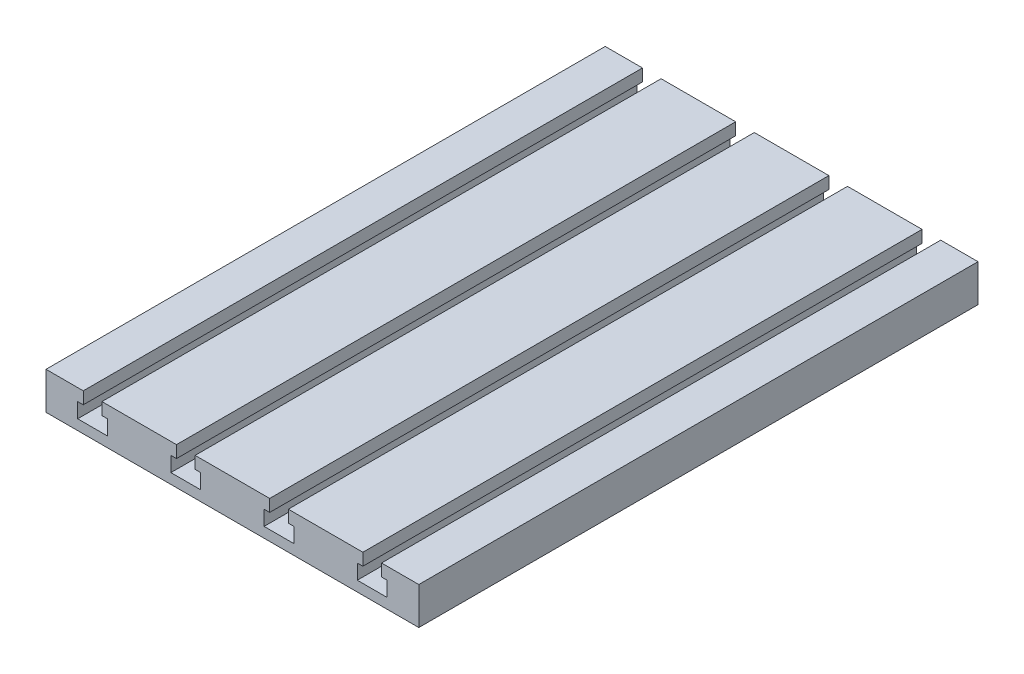
ISO-10303-21;
HEADER;
FILE_DESCRIPTION(('STEP AP214'),'2;1');
FILE_NAME('part.step','',(''),(''),'','','');
FILE_SCHEMA(('AUTOMOTIVE_DESIGN { 1 0 10303 214 1 1 1 1 }'));
ENDSEC;
DATA;
#1=APPLICATION_CONTEXT('core data for automotive mechanical design processes');
#2=APPLICATION_PROTOCOL_DEFINITION('international standard','automotive_design',2000,#1);
#3=PRODUCT_CONTEXT('',#1,'mechanical');
#4=PRODUCT('Part','Part','',(#3));
#5=PRODUCT_RELATED_PRODUCT_CATEGORY('part','',(#4));
#6=PRODUCT_DEFINITION_FORMATION('','',#4);
#7=PRODUCT_DEFINITION_CONTEXT('part definition',#1,'design');
#8=PRODUCT_DEFINITION('design','',#6,#7);
#9=PRODUCT_DEFINITION_SHAPE('','',#8);
#10=(LENGTH_UNIT() NAMED_UNIT(*) SI_UNIT(.MILLI.,.METRE.));
#11=(NAMED_UNIT(*) PLANE_ANGLE_UNIT() SI_UNIT($,.RADIAN.));
#12=(NAMED_UNIT(*) SI_UNIT($,.STERADIAN.) SOLID_ANGLE_UNIT());
#13=UNCERTAINTY_MEASURE_WITH_UNIT(LENGTH_MEASURE(1.E-05),#10,'distance_accuracy_value','');
#14=(GEOMETRIC_REPRESENTATION_CONTEXT(3) GLOBAL_UNCERTAINTY_ASSIGNED_CONTEXT((#13)) GLOBAL_UNIT_ASSIGNED_CONTEXT((#10,
#11,#12)) REPRESENTATION_CONTEXT('',''));
#15=CARTESIAN_POINT('',(0.,0.,0.));
#16=DIRECTION('',(0.,0.,1.));
#17=DIRECTION('',(1.,0.,0.));
#18=AXIS2_PLACEMENT_3D('',#15,#16,#17);
#19=CARTESIAN_POINT('',(200.,0.,300.));
#20=DIRECTION('',(0.,1.,0.));
#21=DIRECTION('',(-1.,0.,0.));
#22=AXIS2_PLACEMENT_3D('',#19,#20,#21);
#23=PLANE('',#22);
#24=DIRECTION('',(1.,0.,0.));
#25=VECTOR('',#24,1.);
#26=CARTESIAN_POINT('',(200.,0.,0.));
#27=LINE('',#26,#25);
#28=CARTESIAN_POINT('',(0.,0.,0.));
#29=VERTEX_POINT('',#28);
#30=CARTESIAN_POINT('',(200.,0.,0.));
#31=VERTEX_POINT('',#30);
#32=EDGE_CURVE('E296',#29,#31,#27,.T.);
#33=ORIENTED_EDGE('',*,*,#32,.T.);
#34=DIRECTION('',(0.,0.,-1.));
#35=VECTOR('',#34,1.);
#36=CARTESIAN_POINT('',(200.,0.,300.));
#37=LINE('',#36,#35);
#38=CARTESIAN_POINT('',(200.,0.,300.));
#39=VERTEX_POINT('',#38);
#40=EDGE_CURVE('E11',#39,#31,#37,.T.);
#41=ORIENTED_EDGE('',*,*,#40,.F.);
#42=DIRECTION('',(1.,0.,0.));
#43=VECTOR('',#42,1.);
#44=CARTESIAN_POINT('',(200.,0.,300.));
#45=LINE('',#44,#43);
#46=CARTESIAN_POINT('',(0.,0.,300.));
#47=VERTEX_POINT('',#46);
#48=EDGE_CURVE('E366',#47,#39,#45,.T.);
#49=ORIENTED_EDGE('',*,*,#48,.F.);
#50=DIRECTION('',(0.,0.,-1.));
#51=VECTOR('',#50,1.);
#52=CARTESIAN_POINT('',(0.,0.,300.));
#53=LINE('',#52,#51);
#54=EDGE_CURVE('E292',#47,#29,#53,.T.);
#55=ORIENTED_EDGE('',*,*,#54,.T.);
#56=EDGE_LOOP('',(#33,#41,#49,#55));
#57=FACE_BOUND('',#56,.T.);
#58=ADVANCED_FACE('F32',(#57),#23,.F.);
#59=CARTESIAN_POINT('',(200.,20.,300.));
#60=DIRECTION('',(-1.,0.,0.));
#61=DIRECTION('',(0.,0.,1.));
#62=AXIS2_PLACEMENT_3D('',#59,#60,#61);
#63=PLANE('',#62);
#64=DIRECTION('',(0.,1.,0.));
#65=VECTOR('',#64,1.);
#66=CARTESIAN_POINT('',(200.,20.,0.));
#67=LINE('',#66,#65);
#68=CARTESIAN_POINT('',(200.,20.,0.));
#69=VERTEX_POINT('',#68);
#70=EDGE_CURVE('E299',#31,#69,#67,.T.);
#71=ORIENTED_EDGE('',*,*,#70,.T.);
#72=DIRECTION('',(0.,0.,-1.));
#73=VECTOR('',#72,1.);
#74=CARTESIAN_POINT('',(200.,20.,300.));
#75=LINE('',#74,#73);
#76=CARTESIAN_POINT('',(200.,20.,300.));
#77=VERTEX_POINT('',#76);
#78=EDGE_CURVE('E40',#77,#69,#75,.T.);
#79=ORIENTED_EDGE('',*,*,#78,.F.);
#80=DIRECTION('',(0.,1.,0.));
#81=VECTOR('',#80,1.);
#82=CARTESIAN_POINT('',(200.,20.,300.));
#83=LINE('',#82,#81);
#84=EDGE_CURVE('E175',#39,#77,#83,.T.);
#85=ORIENTED_EDGE('',*,*,#84,.F.);
#86=ORIENTED_EDGE('',*,*,#40,.T.);
#87=EDGE_LOOP('',(#71,#79,#85,#86));
#88=FACE_BOUND('',#87,.T.);
#89=ADVANCED_FACE('F564',(#88),#63,.F.);
#90=CARTESIAN_POINT('',(180.,20.,300.));
#91=DIRECTION('',(0.,-1.,0.));
#92=DIRECTION('',(1.,0.,0.));
#93=AXIS2_PLACEMENT_3D('',#90,#91,#92);
#94=PLANE('',#93);
#95=DIRECTION('',(-1.,0.,0.));
#96=VECTOR('',#95,1.);
#97=CARTESIAN_POINT('',(180.,20.,0.));
#98=LINE('',#97,#96);
#99=CARTESIAN_POINT('',(180.,20.,0.));
#100=VERTEX_POINT('',#99);
#101=EDGE_CURVE('E301',#69,#100,#98,.T.);
#102=ORIENTED_EDGE('',*,*,#101,.T.);
#103=DIRECTION('',(0.,0.,-1.));
#104=VECTOR('',#103,1.);
#105=CARTESIAN_POINT('',(180.,20.,300.));
#106=LINE('',#105,#104);
#107=CARTESIAN_POINT('',(180.,20.,300.));
#108=VERTEX_POINT('',#107);
#109=EDGE_CURVE('E457',#108,#100,#106,.T.);
#110=ORIENTED_EDGE('',*,*,#109,.F.);
#111=DIRECTION('',(-1.,0.,0.));
#112=VECTOR('',#111,1.);
#113=CARTESIAN_POINT('',(180.,20.,300.));
#114=LINE('',#113,#112);
#115=EDGE_CURVE('E465',#77,#108,#114,.T.);
#116=ORIENTED_EDGE('',*,*,#115,.F.);
#117=ORIENTED_EDGE('',*,*,#78,.T.);
#118=EDGE_LOOP('',(#102,#110,#116,#117));
#119=FACE_BOUND('',#118,.T.);
#120=ADVANCED_FACE('F463',(#119),#94,.F.);
#121=CARTESIAN_POINT('',(180.,13.5,300.));
#122=DIRECTION('',(1.,0.,0.));
#123=DIRECTION('',(0.,0.,-1.));
#124=AXIS2_PLACEMENT_3D('',#121,#122,#123);
#125=PLANE('',#124);
#126=DIRECTION('',(0.,-1.,0.));
#127=VECTOR('',#126,1.);
#128=CARTESIAN_POINT('',(180.,13.5,0.));
#129=LINE('',#128,#127);
#130=CARTESIAN_POINT('',(180.,13.5,0.));
#131=VERTEX_POINT('',#130);
#132=EDGE_CURVE('E303',#100,#131,#129,.T.);
#133=ORIENTED_EDGE('',*,*,#132,.T.);
#134=DIRECTION('',(0.,0.,-1.));
#135=VECTOR('',#134,1.);
#136=CARTESIAN_POINT('',(180.,13.5,300.));
#137=LINE('',#136,#135);
#138=CARTESIAN_POINT('',(180.,13.5,300.));
#139=VERTEX_POINT('',#138);
#140=EDGE_CURVE('E454',#139,#131,#137,.T.);
#141=ORIENTED_EDGE('',*,*,#140,.F.);
#142=DIRECTION('',(0.,-1.,0.));
#143=VECTOR('',#142,1.);
#144=CARTESIAN_POINT('',(180.,13.5,300.));
#145=LINE('',#144,#143);
#146=EDGE_CURVE('E483',#108,#139,#145,.T.);
#147=ORIENTED_EDGE('',*,*,#146,.F.);
#148=ORIENTED_EDGE('',*,*,#109,.T.);
#149=EDGE_LOOP('',(#133,#141,#147,#148));
#150=FACE_BOUND('',#149,.T.);
#151=ADVANCED_FACE('F474',(#150),#125,.F.);
#152=CARTESIAN_POINT('',(183.,13.5,300.));
#153=DIRECTION('',(0.,1.,0.));
#154=DIRECTION('',(0.,0.,1.));
#155=AXIS2_PLACEMENT_3D('',#152,#153,#154);
#156=PLANE('',#155);
#157=DIRECTION('',(1.,0.,0.));
#158=VECTOR('',#157,1.);
#159=CARTESIAN_POINT('',(183.,13.5,0.));
#160=LINE('',#159,#158);
#161=CARTESIAN_POINT('',(183.,13.5,0.));
#162=VERTEX_POINT('',#161);
#163=EDGE_CURVE('E305',#131,#162,#160,.T.);
#164=ORIENTED_EDGE('',*,*,#163,.T.);
#165=DIRECTION('',(0.,0.,-1.));
#166=VECTOR('',#165,1.);
#167=CARTESIAN_POINT('',(183.,13.5,300.));
#168=LINE('',#167,#166);
#169=CARTESIAN_POINT('',(183.,13.5,300.));
#170=VERTEX_POINT('',#169);
#171=EDGE_CURVE('E451',#170,#162,#168,.T.);
#172=ORIENTED_EDGE('',*,*,#171,.F.);
#173=DIRECTION('',(1.,0.,0.));
#174=VECTOR('',#173,1.);
#175=CARTESIAN_POINT('',(183.,13.5,300.));
#176=LINE('',#175,#174);
#177=EDGE_CURVE('E480',#139,#170,#176,.T.);
#178=ORIENTED_EDGE('',*,*,#177,.F.);
#179=ORIENTED_EDGE('',*,*,#140,.T.);
#180=EDGE_LOOP('',(#164,#172,#178,#179));
#181=FACE_BOUND('',#180,.T.);
#182=ADVANCED_FACE('F478',(#181),#156,.F.);
#183=CARTESIAN_POINT('',(183.,5.50000000000001,300.));
#184=DIRECTION('',(1.,0.,0.));
#185=DIRECTION('',(0.,0.,-1.));
#186=AXIS2_PLACEMENT_3D('',#183,#184,#185);
#187=PLANE('',#186);
#188=DIRECTION('',(0.,-1.,0.));
#189=VECTOR('',#188,1.);
#190=CARTESIAN_POINT('',(183.,5.50000000000001,0.));
#191=LINE('',#190,#189);
#192=CARTESIAN_POINT('',(183.,5.50000000000001,0.));
#193=VERTEX_POINT('',#192);
#194=EDGE_CURVE('E307',#162,#193,#191,.T.);
#195=ORIENTED_EDGE('',*,*,#194,.T.);
#196=DIRECTION('',(0.,0.,-1.));
#197=VECTOR('',#196,1.);
#198=CARTESIAN_POINT('',(183.,5.50000000000001,300.));
#199=LINE('',#198,#197);
#200=CARTESIAN_POINT('',(183.,5.50000000000001,300.));
#201=VERTEX_POINT('',#200);
#202=EDGE_CURVE('E448',#201,#193,#199,.T.);
#203=ORIENTED_EDGE('',*,*,#202,.F.);
#204=DIRECTION('',(0.,-1.,0.));
#205=VECTOR('',#204,1.);
#206=CARTESIAN_POINT('',(183.,5.50000000000001,300.));
#207=LINE('',#206,#205);
#208=EDGE_CURVE('E482',#170,#201,#207,.T.);
#209=ORIENTED_EDGE('',*,*,#208,.F.);
#210=ORIENTED_EDGE('',*,*,#171,.T.);
#211=EDGE_LOOP('',(#195,#203,#209,#210));
#212=FACE_BOUND('',#211,.T.);
#213=ADVANCED_FACE('F577',(#212),#187,.F.);
#214=CARTESIAN_POINT('',(167.,5.50000000000001,300.));
#215=DIRECTION('',(0.,-1.,0.));
#216=DIRECTION('',(0.,0.,-1.));
#217=AXIS2_PLACEMENT_3D('',#214,#215,#216);
#218=PLANE('',#217);
#219=DIRECTION('',(-1.,0.,0.));
#220=VECTOR('',#219,1.);
#221=CARTESIAN_POINT('',(167.,5.50000000000001,0.));
#222=LINE('',#221,#220);
#223=CARTESIAN_POINT('',(167.,5.50000000000001,0.));
#224=VERTEX_POINT('',#223);
#225=EDGE_CURVE('E309',#193,#224,#222,.T.);
#226=ORIENTED_EDGE('',*,*,#225,.T.);
#227=DIRECTION('',(0.,0.,-1.));
#228=VECTOR('',#227,1.);
#229=CARTESIAN_POINT('',(167.,5.50000000000001,300.));
#230=LINE('',#229,#228);
#231=CARTESIAN_POINT('',(167.,5.50000000000001,300.));
#232=VERTEX_POINT('',#231);
#233=EDGE_CURVE('E445',#232,#224,#230,.T.);
#234=ORIENTED_EDGE('',*,*,#233,.F.);
#235=DIRECTION('',(-1.,0.,0.));
#236=VECTOR('',#235,1.);
#237=CARTESIAN_POINT('',(167.,5.50000000000001,300.));
#238=LINE('',#237,#236);
#239=EDGE_CURVE('E485',#201,#232,#238,.T.);
#240=ORIENTED_EDGE('',*,*,#239,.F.);
#241=ORIENTED_EDGE('',*,*,#202,.T.);
#242=EDGE_LOOP('',(#226,#234,#240,#241));
#243=FACE_BOUND('',#242,.T.);
#244=ADVANCED_FACE('F580',(#243),#218,.F.);
#245=CARTESIAN_POINT('',(167.,13.5,300.));
#246=DIRECTION('',(-1.,0.,0.));
#247=DIRECTION('',(0.,0.,1.));
#248=AXIS2_PLACEMENT_3D('',#245,#246,#247);
#249=PLANE('',#248);
#250=DIRECTION('',(0.,1.,0.));
#251=VECTOR('',#250,1.);
#252=CARTESIAN_POINT('',(167.,13.5,0.));
#253=LINE('',#252,#251);
#254=CARTESIAN_POINT('',(167.,13.5,0.));
#255=VERTEX_POINT('',#254);
#256=EDGE_CURVE('E311',#224,#255,#253,.T.);
#257=ORIENTED_EDGE('',*,*,#256,.T.);
#258=DIRECTION('',(0.,0.,-1.));
#259=VECTOR('',#258,1.);
#260=CARTESIAN_POINT('',(167.,13.5,300.));
#261=LINE('',#260,#259);
#262=CARTESIAN_POINT('',(167.,13.5,300.));
#263=VERTEX_POINT('',#262);
#264=EDGE_CURVE('E442',#263,#255,#261,.T.);
#265=ORIENTED_EDGE('',*,*,#264,.F.);
#266=DIRECTION('',(0.,1.,0.));
#267=VECTOR('',#266,1.);
#268=CARTESIAN_POINT('',(167.,13.5,300.));
#269=LINE('',#268,#267);
#270=EDGE_CURVE('E491',#232,#263,#269,.T.);
#271=ORIENTED_EDGE('',*,*,#270,.F.);
#272=ORIENTED_EDGE('',*,*,#233,.T.);
#273=EDGE_LOOP('',(#257,#265,#271,#272));
#274=FACE_BOUND('',#273,.T.);
#275=ADVANCED_FACE('F584',(#274),#249,.F.);
#276=CARTESIAN_POINT('',(170.,13.5,300.));
#277=DIRECTION('',(0.,1.,0.));
#278=DIRECTION('',(-1.,0.,0.));
#279=AXIS2_PLACEMENT_3D('',#276,#277,#278);
#280=PLANE('',#279);
#281=DIRECTION('',(1.,0.,0.));
#282=VECTOR('',#281,1.);
#283=CARTESIAN_POINT('',(170.,13.5,0.));
#284=LINE('',#283,#282);
#285=CARTESIAN_POINT('',(170.,13.5,0.));
#286=VERTEX_POINT('',#285);
#287=EDGE_CURVE('E313',#255,#286,#284,.T.);
#288=ORIENTED_EDGE('',*,*,#287,.T.);
#289=DIRECTION('',(0.,0.,-1.));
#290=VECTOR('',#289,1.);
#291=CARTESIAN_POINT('',(170.,13.5,300.));
#292=LINE('',#291,#290);
#293=CARTESIAN_POINT('',(170.,13.5,300.));
#294=VERTEX_POINT('',#293);
#295=EDGE_CURVE('E439',#294,#286,#292,.T.);
#296=ORIENTED_EDGE('',*,*,#295,.F.);
#297=DIRECTION('',(1.,0.,0.));
#298=VECTOR('',#297,1.);
#299=CARTESIAN_POINT('',(170.,13.5,300.));
#300=LINE('',#299,#298);
#301=EDGE_CURVE('E493',#263,#294,#300,.T.);
#302=ORIENTED_EDGE('',*,*,#301,.F.);
#303=ORIENTED_EDGE('',*,*,#264,.T.);
#304=EDGE_LOOP('',(#288,#296,#302,#303));
#305=FACE_BOUND('',#304,.T.);
#306=ADVANCED_FACE('F588',(#305),#280,.F.);
#307=CARTESIAN_POINT('',(170.,20.,300.));
#308=DIRECTION('',(-1.,0.,0.));
#309=DIRECTION('',(0.,0.,1.));
#310=AXIS2_PLACEMENT_3D('',#307,#308,#309);
#311=PLANE('',#310);
#312=DIRECTION('',(0.,1.,0.));
#313=VECTOR('',#312,1.);
#314=CARTESIAN_POINT('',(170.,20.,0.));
#315=LINE('',#314,#313);
#316=CARTESIAN_POINT('',(170.,20.,0.));
#317=VERTEX_POINT('',#316);
#318=EDGE_CURVE('E315',#286,#317,#315,.T.);
#319=ORIENTED_EDGE('',*,*,#318,.T.);
#320=DIRECTION('',(0.,0.,-1.));
#321=VECTOR('',#320,1.);
#322=CARTESIAN_POINT('',(170.,20.,300.));
#323=LINE('',#322,#321);
#324=CARTESIAN_POINT('',(170.,20.,300.));
#325=VERTEX_POINT('',#324);
#326=EDGE_CURVE('E436',#325,#317,#323,.T.);
#327=ORIENTED_EDGE('',*,*,#326,.F.);
#328=DIRECTION('',(0.,1.,0.));
#329=VECTOR('',#328,1.);
#330=CARTESIAN_POINT('',(170.,20.,300.));
#331=LINE('',#330,#329);
#332=EDGE_CURVE('E495',#294,#325,#331,.T.);
#333=ORIENTED_EDGE('',*,*,#332,.F.);
#334=ORIENTED_EDGE('',*,*,#295,.T.);
#335=EDGE_LOOP('',(#319,#327,#333,#334));
#336=FACE_BOUND('',#335,.T.);
#337=ADVANCED_FACE('F592',(#336),#311,.F.);
#338=CARTESIAN_POINT('',(130.,20.,300.));
#339=DIRECTION('',(0.,-1.,0.));
#340=DIRECTION('',(0.,0.,-1.));
#341=AXIS2_PLACEMENT_3D('',#338,#339,#340);
#342=PLANE('',#341);
#343=DIRECTION('',(-1.,0.,0.));
#344=VECTOR('',#343,1.);
#345=CARTESIAN_POINT('',(130.,20.,0.));
#346=LINE('',#345,#344);
#347=CARTESIAN_POINT('',(130.,20.,0.));
#348=VERTEX_POINT('',#347);
#349=EDGE_CURVE('E317',#317,#348,#346,.T.);
#350=ORIENTED_EDGE('',*,*,#349,.T.);
#351=DIRECTION('',(0.,0.,-1.));
#352=VECTOR('',#351,1.);
#353=CARTESIAN_POINT('',(130.,20.,300.));
#354=LINE('',#353,#352);
#355=CARTESIAN_POINT('',(130.,20.,300.));
#356=VERTEX_POINT('',#355);
#357=EDGE_CURVE('E433',#356,#348,#354,.T.);
#358=ORIENTED_EDGE('',*,*,#357,.F.);
#359=DIRECTION('',(-1.,0.,0.));
#360=VECTOR('',#359,1.);
#361=CARTESIAN_POINT('',(130.,20.,300.));
#362=LINE('',#361,#360);
#363=EDGE_CURVE('E497',#325,#356,#362,.T.);
#364=ORIENTED_EDGE('',*,*,#363,.F.);
#365=ORIENTED_EDGE('',*,*,#326,.T.);
#366=EDGE_LOOP('',(#350,#358,#364,#365));
#367=FACE_BOUND('',#366,.T.);
#368=ADVANCED_FACE('F596',(#367),#342,.F.);
#369=CARTESIAN_POINT('',(130.,13.5,300.));
#370=DIRECTION('',(1.,0.,0.));
#371=DIRECTION('',(0.,0.,-1.));
#372=AXIS2_PLACEMENT_3D('',#369,#370,#371);
#373=PLANE('',#372);
#374=DIRECTION('',(0.,-1.,0.));
#375=VECTOR('',#374,1.);
#376=CARTESIAN_POINT('',(130.,13.5,0.));
#377=LINE('',#376,#375);
#378=CARTESIAN_POINT('',(130.,13.5,0.));
#379=VERTEX_POINT('',#378);
#380=EDGE_CURVE('E319',#348,#379,#377,.T.);
#381=ORIENTED_EDGE('',*,*,#380,.T.);
#382=DIRECTION('',(0.,0.,-1.));
#383=VECTOR('',#382,1.);
#384=CARTESIAN_POINT('',(130.,13.5,300.));
#385=LINE('',#384,#383);
#386=CARTESIAN_POINT('',(130.,13.5,300.));
#387=VERTEX_POINT('',#386);
#388=EDGE_CURVE('E430',#387,#379,#385,.T.);
#389=ORIENTED_EDGE('',*,*,#388,.F.);
#390=DIRECTION('',(0.,-1.,0.));
#391=VECTOR('',#390,1.);
#392=CARTESIAN_POINT('',(130.,13.5,300.));
#393=LINE('',#392,#391);
#394=EDGE_CURVE('E499',#356,#387,#393,.T.);
#395=ORIENTED_EDGE('',*,*,#394,.F.);
#396=ORIENTED_EDGE('',*,*,#357,.T.);
#397=EDGE_LOOP('',(#381,#389,#395,#396));
#398=FACE_BOUND('',#397,.T.);
#399=ADVANCED_FACE('F600',(#398),#373,.F.);
#400=CARTESIAN_POINT('',(133.,13.5,300.));
#401=DIRECTION('',(0.,1.,0.));
#402=DIRECTION('',(-1.,0.,0.));
#403=AXIS2_PLACEMENT_3D('',#400,#401,#402);
#404=PLANE('',#403);
#405=DIRECTION('',(1.,0.,0.));
#406=VECTOR('',#405,1.);
#407=CARTESIAN_POINT('',(133.,13.5,0.));
#408=LINE('',#407,#406);
#409=CARTESIAN_POINT('',(133.,13.5,0.));
#410=VERTEX_POINT('',#409);
#411=EDGE_CURVE('E321',#379,#410,#408,.T.);
#412=ORIENTED_EDGE('',*,*,#411,.T.);
#413=DIRECTION('',(0.,0.,-1.));
#414=VECTOR('',#413,1.);
#415=CARTESIAN_POINT('',(133.,13.5,300.));
#416=LINE('',#415,#414);
#417=CARTESIAN_POINT('',(133.,13.5,300.));
#418=VERTEX_POINT('',#417);
#419=EDGE_CURVE('E427',#418,#410,#416,.T.);
#420=ORIENTED_EDGE('',*,*,#419,.F.);
#421=DIRECTION('',(1.,0.,0.));
#422=VECTOR('',#421,1.);
#423=CARTESIAN_POINT('',(133.,13.5,300.));
#424=LINE('',#423,#422);
#425=EDGE_CURVE('E501',#387,#418,#424,.T.);
#426=ORIENTED_EDGE('',*,*,#425,.F.);
#427=ORIENTED_EDGE('',*,*,#388,.T.);
#428=EDGE_LOOP('',(#412,#420,#426,#427));
#429=FACE_BOUND('',#428,.T.);
#430=ADVANCED_FACE('F604',(#429),#404,.F.);
#431=CARTESIAN_POINT('',(133.,5.5,300.));
#432=DIRECTION('',(1.,0.,0.));
#433=DIRECTION('',(0.,0.,-1.));
#434=AXIS2_PLACEMENT_3D('',#431,#432,#433);
#435=PLANE('',#434);
#436=DIRECTION('',(0.,-1.,0.));
#437=VECTOR('',#436,1.);
#438=CARTESIAN_POINT('',(133.,5.5,0.));
#439=LINE('',#438,#437);
#440=CARTESIAN_POINT('',(133.,5.5,0.));
#441=VERTEX_POINT('',#440);
#442=EDGE_CURVE('E323',#410,#441,#439,.T.);
#443=ORIENTED_EDGE('',*,*,#442,.T.);
#444=DIRECTION('',(0.,0.,-1.));
#445=VECTOR('',#444,1.);
#446=CARTESIAN_POINT('',(133.,5.5,300.));
#447=LINE('',#446,#445);
#448=CARTESIAN_POINT('',(133.,5.5,300.));
#449=VERTEX_POINT('',#448);
#450=EDGE_CURVE('E424',#449,#441,#447,.T.);
#451=ORIENTED_EDGE('',*,*,#450,.F.);
#452=DIRECTION('',(0.,-1.,0.));
#453=VECTOR('',#452,1.);
#454=CARTESIAN_POINT('',(133.,5.5,300.));
#455=LINE('',#454,#453);
#456=EDGE_CURVE('E503',#418,#449,#455,.T.);
#457=ORIENTED_EDGE('',*,*,#456,.F.);
#458=ORIENTED_EDGE('',*,*,#419,.T.);
#459=EDGE_LOOP('',(#443,#451,#457,#458));
#460=FACE_BOUND('',#459,.T.);
#461=ADVANCED_FACE('F608',(#460),#435,.F.);
#462=CARTESIAN_POINT('',(117.,5.5,300.));
#463=DIRECTION('',(0.,-1.,0.));
#464=DIRECTION('',(0.,0.,-1.));
#465=AXIS2_PLACEMENT_3D('',#462,#463,#464);
#466=PLANE('',#465);
#467=DIRECTION('',(-1.,0.,0.));
#468=VECTOR('',#467,1.);
#469=CARTESIAN_POINT('',(117.,5.5,0.));
#470=LINE('',#469,#468);
#471=CARTESIAN_POINT('',(117.,5.5,0.));
#472=VERTEX_POINT('',#471);
#473=EDGE_CURVE('E325',#441,#472,#470,.T.);
#474=ORIENTED_EDGE('',*,*,#473,.T.);
#475=DIRECTION('',(0.,0.,-1.));
#476=VECTOR('',#475,1.);
#477=CARTESIAN_POINT('',(117.,5.5,300.));
#478=LINE('',#477,#476);
#479=CARTESIAN_POINT('',(117.,5.5,300.));
#480=VERTEX_POINT('',#479);
#481=EDGE_CURVE('E421',#480,#472,#478,.T.);
#482=ORIENTED_EDGE('',*,*,#481,.F.);
#483=DIRECTION('',(-1.,0.,0.));
#484=VECTOR('',#483,1.);
#485=CARTESIAN_POINT('',(117.,5.5,300.));
#486=LINE('',#485,#484);
#487=EDGE_CURVE('E505',#449,#480,#486,.T.);
#488=ORIENTED_EDGE('',*,*,#487,.F.);
#489=ORIENTED_EDGE('',*,*,#450,.T.);
#490=EDGE_LOOP('',(#474,#482,#488,#489));
#491=FACE_BOUND('',#490,.T.);
#492=ADVANCED_FACE('F612',(#491),#466,.F.);
#493=CARTESIAN_POINT('',(117.,13.5,300.));
#494=DIRECTION('',(-1.,0.,0.));
#495=DIRECTION('',(0.,0.,1.));
#496=AXIS2_PLACEMENT_3D('',#493,#494,#495);
#497=PLANE('',#496);
#498=DIRECTION('',(0.,1.,0.));
#499=VECTOR('',#498,1.);
#500=CARTESIAN_POINT('',(117.,13.5,0.));
#501=LINE('',#500,#499);
#502=CARTESIAN_POINT('',(117.,13.5,0.));
#503=VERTEX_POINT('',#502);
#504=EDGE_CURVE('E327',#472,#503,#501,.T.);
#505=ORIENTED_EDGE('',*,*,#504,.T.);
#506=DIRECTION('',(0.,0.,-1.));
#507=VECTOR('',#506,1.);
#508=CARTESIAN_POINT('',(117.,13.5,300.));
#509=LINE('',#508,#507);
#510=CARTESIAN_POINT('',(117.,13.5,300.));
#511=VERTEX_POINT('',#510);
#512=EDGE_CURVE('E418',#511,#503,#509,.T.);
#513=ORIENTED_EDGE('',*,*,#512,.F.);
#514=DIRECTION('',(0.,1.,0.));
#515=VECTOR('',#514,1.);
#516=CARTESIAN_POINT('',(117.,13.5,300.));
#517=LINE('',#516,#515);
#518=EDGE_CURVE('E507',#480,#511,#517,.T.);
#519=ORIENTED_EDGE('',*,*,#518,.F.);
#520=ORIENTED_EDGE('',*,*,#481,.T.);
#521=EDGE_LOOP('',(#505,#513,#519,#520));
#522=FACE_BOUND('',#521,.T.);
#523=ADVANCED_FACE('F616',(#522),#497,.F.);
#524=CARTESIAN_POINT('',(120.,13.5,300.));
#525=DIRECTION('',(0.,1.,0.));
#526=DIRECTION('',(0.,0.,1.));
#527=AXIS2_PLACEMENT_3D('',#524,#525,#526);
#528=PLANE('',#527);
#529=DIRECTION('',(1.,0.,0.));
#530=VECTOR('',#529,1.);
#531=CARTESIAN_POINT('',(120.,13.5,0.));
#532=LINE('',#531,#530);
#533=CARTESIAN_POINT('',(120.,13.5,0.));
#534=VERTEX_POINT('',#533);
#535=EDGE_CURVE('E329',#503,#534,#532,.T.);
#536=ORIENTED_EDGE('',*,*,#535,.T.);
#537=DIRECTION('',(0.,0.,-1.));
#538=VECTOR('',#537,1.);
#539=CARTESIAN_POINT('',(120.,13.5,300.));
#540=LINE('',#539,#538);
#541=CARTESIAN_POINT('',(120.,13.5,300.));
#542=VERTEX_POINT('',#541);
#543=EDGE_CURVE('E415',#542,#534,#540,.T.);
#544=ORIENTED_EDGE('',*,*,#543,.F.);
#545=DIRECTION('',(1.,0.,0.));
#546=VECTOR('',#545,1.);
#547=CARTESIAN_POINT('',(120.,13.5,300.));
#548=LINE('',#547,#546);
#549=EDGE_CURVE('E509',#511,#542,#548,.T.);
#550=ORIENTED_EDGE('',*,*,#549,.F.);
#551=ORIENTED_EDGE('',*,*,#512,.T.);
#552=EDGE_LOOP('',(#536,#544,#550,#551));
#553=FACE_BOUND('',#552,.T.);
#554=ADVANCED_FACE('F620',(#553),#528,.F.);
#555=CARTESIAN_POINT('',(120.,20.,300.));
#556=DIRECTION('',(-1.,0.,0.));
#557=DIRECTION('',(0.,0.,1.));
#558=AXIS2_PLACEMENT_3D('',#555,#556,#557);
#559=PLANE('',#558);
#560=DIRECTION('',(0.,1.,0.));
#561=VECTOR('',#560,1.);
#562=CARTESIAN_POINT('',(120.,20.,0.));
#563=LINE('',#562,#561);
#564=CARTESIAN_POINT('',(120.,20.,0.));
#565=VERTEX_POINT('',#564);
#566=EDGE_CURVE('E331',#534,#565,#563,.T.);
#567=ORIENTED_EDGE('',*,*,#566,.T.);
#568=DIRECTION('',(0.,0.,-1.));
#569=VECTOR('',#568,1.);
#570=CARTESIAN_POINT('',(120.,20.,300.));
#571=LINE('',#570,#569);
#572=CARTESIAN_POINT('',(120.,20.,300.));
#573=VERTEX_POINT('',#572);
#574=EDGE_CURVE('E412',#573,#565,#571,.T.);
#575=ORIENTED_EDGE('',*,*,#574,.F.);
#576=DIRECTION('',(0.,1.,0.));
#577=VECTOR('',#576,1.);
#578=CARTESIAN_POINT('',(120.,20.,300.));
#579=LINE('',#578,#577);
#580=EDGE_CURVE('E511',#542,#573,#579,.T.);
#581=ORIENTED_EDGE('',*,*,#580,.F.);
#582=ORIENTED_EDGE('',*,*,#543,.T.);
#583=EDGE_LOOP('',(#567,#575,#581,#582));
#584=FACE_BOUND('',#583,.T.);
#585=ADVANCED_FACE('F624',(#584),#559,.F.);
#586=CARTESIAN_POINT('',(80.,20.,300.));
#587=DIRECTION('',(0.,-1.,0.));
#588=DIRECTION('',(0.,0.,-1.));
#589=AXIS2_PLACEMENT_3D('',#586,#587,#588);
#590=PLANE('',#589);
#591=DIRECTION('',(-1.,0.,0.));
#592=VECTOR('',#591,1.);
#593=CARTESIAN_POINT('',(80.,20.,0.));
#594=LINE('',#593,#592);
#595=CARTESIAN_POINT('',(80.,20.,0.));
#596=VERTEX_POINT('',#595);
#597=EDGE_CURVE('E333',#565,#596,#594,.T.);
#598=ORIENTED_EDGE('',*,*,#597,.T.);
#599=DIRECTION('',(0.,0.,-1.));
#600=VECTOR('',#599,1.);
#601=CARTESIAN_POINT('',(80.,20.,300.));
#602=LINE('',#601,#600);
#603=CARTESIAN_POINT('',(80.,20.,300.));
#604=VERTEX_POINT('',#603);
#605=EDGE_CURVE('E409',#604,#596,#602,.T.);
#606=ORIENTED_EDGE('',*,*,#605,.F.);
#607=DIRECTION('',(-1.,0.,0.));
#608=VECTOR('',#607,1.);
#609=CARTESIAN_POINT('',(80.,20.,300.));
#610=LINE('',#609,#608);
#611=EDGE_CURVE('E513',#573,#604,#610,.T.);
#612=ORIENTED_EDGE('',*,*,#611,.F.);
#613=ORIENTED_EDGE('',*,*,#574,.T.);
#614=EDGE_LOOP('',(#598,#606,#612,#613));
#615=FACE_BOUND('',#614,.T.);
#616=ADVANCED_FACE('F628',(#615),#590,.F.);
#617=CARTESIAN_POINT('',(80.,13.5,300.));
#618=DIRECTION('',(1.,0.,0.));
#619=DIRECTION('',(0.,0.,-1.));
#620=AXIS2_PLACEMENT_3D('',#617,#618,#619);
#621=PLANE('',#620);
#622=DIRECTION('',(0.,-1.,0.));
#623=VECTOR('',#622,1.);
#624=CARTESIAN_POINT('',(80.,13.5,0.));
#625=LINE('',#624,#623);
#626=CARTESIAN_POINT('',(80.,13.5,0.));
#627=VERTEX_POINT('',#626);
#628=EDGE_CURVE('E335',#596,#627,#625,.T.);
#629=ORIENTED_EDGE('',*,*,#628,.T.);
#630=DIRECTION('',(0.,0.,-1.));
#631=VECTOR('',#630,1.);
#632=CARTESIAN_POINT('',(80.,13.5,300.));
#633=LINE('',#632,#631);
#634=CARTESIAN_POINT('',(80.,13.5,300.));
#635=VERTEX_POINT('',#634);
#636=EDGE_CURVE('E406',#635,#627,#633,.T.);
#637=ORIENTED_EDGE('',*,*,#636,.F.);
#638=DIRECTION('',(0.,-1.,0.));
#639=VECTOR('',#638,1.);
#640=CARTESIAN_POINT('',(80.,13.5,300.));
#641=LINE('',#640,#639);
#642=EDGE_CURVE('E515',#604,#635,#641,.T.);
#643=ORIENTED_EDGE('',*,*,#642,.F.);
#644=ORIENTED_EDGE('',*,*,#605,.T.);
#645=EDGE_LOOP('',(#629,#637,#643,#644));
#646=FACE_BOUND('',#645,.T.);
#647=ADVANCED_FACE('F632',(#646),#621,.F.);
#648=CARTESIAN_POINT('',(83.,13.5,300.));
#649=DIRECTION('',(0.,1.,0.));
#650=DIRECTION('',(-1.,0.,0.));
#651=AXIS2_PLACEMENT_3D('',#648,#649,#650);
#652=PLANE('',#651);
#653=DIRECTION('',(1.,0.,0.));
#654=VECTOR('',#653,1.);
#655=CARTESIAN_POINT('',(83.,13.5,0.));
#656=LINE('',#655,#654);
#657=CARTESIAN_POINT('',(83.,13.5,0.));
#658=VERTEX_POINT('',#657);
#659=EDGE_CURVE('E337',#627,#658,#656,.T.);
#660=ORIENTED_EDGE('',*,*,#659,.T.);
#661=DIRECTION('',(0.,0.,-1.));
#662=VECTOR('',#661,1.);
#663=CARTESIAN_POINT('',(83.,13.5,300.));
#664=LINE('',#663,#662);
#665=CARTESIAN_POINT('',(83.,13.5,300.));
#666=VERTEX_POINT('',#665);
#667=EDGE_CURVE('E403',#666,#658,#664,.T.);
#668=ORIENTED_EDGE('',*,*,#667,.F.);
#669=DIRECTION('',(1.,0.,0.));
#670=VECTOR('',#669,1.);
#671=CARTESIAN_POINT('',(83.,13.5,300.));
#672=LINE('',#671,#670);
#673=EDGE_CURVE('E517',#635,#666,#672,.T.);
#674=ORIENTED_EDGE('',*,*,#673,.F.);
#675=ORIENTED_EDGE('',*,*,#636,.T.);
#676=EDGE_LOOP('',(#660,#668,#674,#675));
#677=FACE_BOUND('',#676,.T.);
#678=ADVANCED_FACE('F636',(#677),#652,.F.);
#679=CARTESIAN_POINT('',(83.,5.5,300.));
#680=DIRECTION('',(1.,0.,0.));
#681=DIRECTION('',(0.,0.,-1.));
#682=AXIS2_PLACEMENT_3D('',#679,#680,#681);
#683=PLANE('',#682);
#684=DIRECTION('',(0.,-1.,0.));
#685=VECTOR('',#684,1.);
#686=CARTESIAN_POINT('',(83.,5.5,0.));
#687=LINE('',#686,#685);
#688=CARTESIAN_POINT('',(83.,5.5,0.));
#689=VERTEX_POINT('',#688);
#690=EDGE_CURVE('E339',#658,#689,#687,.T.);
#691=ORIENTED_EDGE('',*,*,#690,.T.);
#692=DIRECTION('',(0.,0.,-1.));
#693=VECTOR('',#692,1.);
#694=CARTESIAN_POINT('',(83.,5.5,300.));
#695=LINE('',#694,#693);
#696=CARTESIAN_POINT('',(83.,5.5,300.));
#697=VERTEX_POINT('',#696);
#698=EDGE_CURVE('E400',#697,#689,#695,.T.);
#699=ORIENTED_EDGE('',*,*,#698,.F.);
#700=DIRECTION('',(0.,-1.,0.));
#701=VECTOR('',#700,1.);
#702=CARTESIAN_POINT('',(83.,5.5,300.));
#703=LINE('',#702,#701);
#704=EDGE_CURVE('E519',#666,#697,#703,.T.);
#705=ORIENTED_EDGE('',*,*,#704,.F.);
#706=ORIENTED_EDGE('',*,*,#667,.T.);
#707=EDGE_LOOP('',(#691,#699,#705,#706));
#708=FACE_BOUND('',#707,.T.);
#709=ADVANCED_FACE('F640',(#708),#683,.F.);
#710=CARTESIAN_POINT('',(67.,5.5,300.));
#711=DIRECTION('',(0.,-1.,0.));
#712=DIRECTION('',(0.,0.,-1.));
#713=AXIS2_PLACEMENT_3D('',#710,#711,#712);
#714=PLANE('',#713);
#715=DIRECTION('',(-1.,0.,0.));
#716=VECTOR('',#715,1.);
#717=CARTESIAN_POINT('',(67.,5.5,0.));
#718=LINE('',#717,#716);
#719=CARTESIAN_POINT('',(67.,5.5,0.));
#720=VERTEX_POINT('',#719);
#721=EDGE_CURVE('E341',#689,#720,#718,.T.);
#722=ORIENTED_EDGE('',*,*,#721,.T.);
#723=DIRECTION('',(0.,0.,-1.));
#724=VECTOR('',#723,1.);
#725=CARTESIAN_POINT('',(67.,5.5,300.));
#726=LINE('',#725,#724);
#727=CARTESIAN_POINT('',(67.,5.5,300.));
#728=VERTEX_POINT('',#727);
#729=EDGE_CURVE('E397',#728,#720,#726,.T.);
#730=ORIENTED_EDGE('',*,*,#729,.F.);
#731=DIRECTION('',(-1.,0.,0.));
#732=VECTOR('',#731,1.);
#733=CARTESIAN_POINT('',(67.,5.5,300.));
#734=LINE('',#733,#732);
#735=EDGE_CURVE('E521',#697,#728,#734,.T.);
#736=ORIENTED_EDGE('',*,*,#735,.F.);
#737=ORIENTED_EDGE('',*,*,#698,.T.);
#738=EDGE_LOOP('',(#722,#730,#736,#737));
#739=FACE_BOUND('',#738,.T.);
#740=ADVANCED_FACE('F644',(#739),#714,.F.);
#741=CARTESIAN_POINT('',(67.,13.5,300.));
#742=DIRECTION('',(-1.,0.,0.));
#743=DIRECTION('',(0.,0.,1.));
#744=AXIS2_PLACEMENT_3D('',#741,#742,#743);
#745=PLANE('',#744);
#746=DIRECTION('',(0.,1.,0.));
#747=VECTOR('',#746,1.);
#748=CARTESIAN_POINT('',(67.,13.5,0.));
#749=LINE('',#748,#747);
#750=CARTESIAN_POINT('',(67.,13.5,0.));
#751=VERTEX_POINT('',#750);
#752=EDGE_CURVE('E343',#720,#751,#749,.T.);
#753=ORIENTED_EDGE('',*,*,#752,.T.);
#754=DIRECTION('',(0.,0.,-1.));
#755=VECTOR('',#754,1.);
#756=CARTESIAN_POINT('',(67.,13.5,300.));
#757=LINE('',#756,#755);
#758=CARTESIAN_POINT('',(67.,13.5,300.));
#759=VERTEX_POINT('',#758);
#760=EDGE_CURVE('E394',#759,#751,#757,.T.);
#761=ORIENTED_EDGE('',*,*,#760,.F.);
#762=DIRECTION('',(0.,1.,0.));
#763=VECTOR('',#762,1.);
#764=CARTESIAN_POINT('',(67.,13.5,300.));
#765=LINE('',#764,#763);
#766=EDGE_CURVE('E523',#728,#759,#765,.T.);
#767=ORIENTED_EDGE('',*,*,#766,.F.);
#768=ORIENTED_EDGE('',*,*,#729,.T.);
#769=EDGE_LOOP('',(#753,#761,#767,#768));
#770=FACE_BOUND('',#769,.T.);
#771=ADVANCED_FACE('F648',(#770),#745,.F.);
#772=CARTESIAN_POINT('',(70.,13.5,300.));
#773=DIRECTION('',(0.,1.,0.));
#774=DIRECTION('',(-1.,0.,0.));
#775=AXIS2_PLACEMENT_3D('',#772,#773,#774);
#776=PLANE('',#775);
#777=DIRECTION('',(1.,0.,0.));
#778=VECTOR('',#777,1.);
#779=CARTESIAN_POINT('',(70.,13.5,0.));
#780=LINE('',#779,#778);
#781=CARTESIAN_POINT('',(70.,13.5,0.));
#782=VERTEX_POINT('',#781);
#783=EDGE_CURVE('E345',#751,#782,#780,.T.);
#784=ORIENTED_EDGE('',*,*,#783,.T.);
#785=DIRECTION('',(0.,0.,-1.));
#786=VECTOR('',#785,1.);
#787=CARTESIAN_POINT('',(70.,13.5,300.));
#788=LINE('',#787,#786);
#789=CARTESIAN_POINT('',(70.,13.5,300.));
#790=VERTEX_POINT('',#789);
#791=EDGE_CURVE('E391',#790,#782,#788,.T.);
#792=ORIENTED_EDGE('',*,*,#791,.F.);
#793=DIRECTION('',(1.,0.,0.));
#794=VECTOR('',#793,1.);
#795=CARTESIAN_POINT('',(70.,13.5,300.));
#796=LINE('',#795,#794);
#797=EDGE_CURVE('E525',#759,#790,#796,.T.);
#798=ORIENTED_EDGE('',*,*,#797,.F.);
#799=ORIENTED_EDGE('',*,*,#760,.T.);
#800=EDGE_LOOP('',(#784,#792,#798,#799));
#801=FACE_BOUND('',#800,.T.);
#802=ADVANCED_FACE('F652',(#801),#776,.F.);
#803=CARTESIAN_POINT('',(70.,20.,300.));
#804=DIRECTION('',(-1.,0.,0.));
#805=DIRECTION('',(0.,0.,1.));
#806=AXIS2_PLACEMENT_3D('',#803,#804,#805);
#807=PLANE('',#806);
#808=DIRECTION('',(0.,1.,0.));
#809=VECTOR('',#808,1.);
#810=CARTESIAN_POINT('',(70.,20.,0.));
#811=LINE('',#810,#809);
#812=CARTESIAN_POINT('',(70.,20.,0.));
#813=VERTEX_POINT('',#812);
#814=EDGE_CURVE('E347',#782,#813,#811,.T.);
#815=ORIENTED_EDGE('',*,*,#814,.T.);
#816=DIRECTION('',(0.,0.,-1.));
#817=VECTOR('',#816,1.);
#818=CARTESIAN_POINT('',(70.,20.,300.));
#819=LINE('',#818,#817);
#820=CARTESIAN_POINT('',(70.,20.,300.));
#821=VERTEX_POINT('',#820);
#822=EDGE_CURVE('E388',#821,#813,#819,.T.);
#823=ORIENTED_EDGE('',*,*,#822,.F.);
#824=DIRECTION('',(0.,1.,0.));
#825=VECTOR('',#824,1.);
#826=CARTESIAN_POINT('',(70.,20.,300.));
#827=LINE('',#826,#825);
#828=EDGE_CURVE('E527',#790,#821,#827,.T.);
#829=ORIENTED_EDGE('',*,*,#828,.F.);
#830=ORIENTED_EDGE('',*,*,#791,.T.);
#831=EDGE_LOOP('',(#815,#823,#829,#830));
#832=FACE_BOUND('',#831,.T.);
#833=ADVANCED_FACE('F656',(#832),#807,.F.);
#834=CARTESIAN_POINT('',(30.,20.,300.));
#835=DIRECTION('',(0.,-1.,0.));
#836=DIRECTION('',(0.,0.,-1.));
#837=AXIS2_PLACEMENT_3D('',#834,#835,#836);
#838=PLANE('',#837);
#839=DIRECTION('',(-1.,0.,0.));
#840=VECTOR('',#839,1.);
#841=CARTESIAN_POINT('',(30.,20.,0.));
#842=LINE('',#841,#840);
#843=CARTESIAN_POINT('',(30.,20.,0.));
#844=VERTEX_POINT('',#843);
#845=EDGE_CURVE('E349',#813,#844,#842,.T.);
#846=ORIENTED_EDGE('',*,*,#845,.T.);
#847=DIRECTION('',(0.,0.,-1.));
#848=VECTOR('',#847,1.);
#849=CARTESIAN_POINT('',(30.,20.,300.));
#850=LINE('',#849,#848);
#851=CARTESIAN_POINT('',(30.,20.,300.));
#852=VERTEX_POINT('',#851);
#853=EDGE_CURVE('E385',#852,#844,#850,.T.);
#854=ORIENTED_EDGE('',*,*,#853,.F.);
#855=DIRECTION('',(-1.,0.,0.));
#856=VECTOR('',#855,1.);
#857=CARTESIAN_POINT('',(30.,20.,300.));
#858=LINE('',#857,#856);
#859=EDGE_CURVE('E529',#821,#852,#858,.T.);
#860=ORIENTED_EDGE('',*,*,#859,.F.);
#861=ORIENTED_EDGE('',*,*,#822,.T.);
#862=EDGE_LOOP('',(#846,#854,#860,#861));
#863=FACE_BOUND('',#862,.T.);
#864=ADVANCED_FACE('F660',(#863),#838,.F.);
#865=CARTESIAN_POINT('',(30.,13.5,300.));
#866=DIRECTION('',(1.,0.,0.));
#867=DIRECTION('',(0.,0.,-1.));
#868=AXIS2_PLACEMENT_3D('',#865,#866,#867);
#869=PLANE('',#868);
#870=DIRECTION('',(0.,-1.,0.));
#871=VECTOR('',#870,1.);
#872=CARTESIAN_POINT('',(30.,13.5,0.));
#873=LINE('',#872,#871);
#874=CARTESIAN_POINT('',(30.,13.5,0.));
#875=VERTEX_POINT('',#874);
#876=EDGE_CURVE('E351',#844,#875,#873,.T.);
#877=ORIENTED_EDGE('',*,*,#876,.T.);
#878=DIRECTION('',(0.,0.,-1.));
#879=VECTOR('',#878,1.);
#880=CARTESIAN_POINT('',(30.,13.5,300.));
#881=LINE('',#880,#879);
#882=CARTESIAN_POINT('',(30.,13.5,300.));
#883=VERTEX_POINT('',#882);
#884=EDGE_CURVE('E382',#883,#875,#881,.T.);
#885=ORIENTED_EDGE('',*,*,#884,.F.);
#886=DIRECTION('',(0.,-1.,0.));
#887=VECTOR('',#886,1.);
#888=CARTESIAN_POINT('',(30.,13.5,300.));
#889=LINE('',#888,#887);
#890=EDGE_CURVE('E531',#852,#883,#889,.T.);
#891=ORIENTED_EDGE('',*,*,#890,.F.);
#892=ORIENTED_EDGE('',*,*,#853,.T.);
#893=EDGE_LOOP('',(#877,#885,#891,#892));
#894=FACE_BOUND('',#893,.T.);
#895=ADVANCED_FACE('F664',(#894),#869,.F.);
#896=CARTESIAN_POINT('',(33.,13.5,300.));
#897=DIRECTION('',(0.,1.,0.));
#898=DIRECTION('',(0.,0.,1.));
#899=AXIS2_PLACEMENT_3D('',#896,#897,#898);
#900=PLANE('',#899);
#901=DIRECTION('',(1.,0.,0.));
#902=VECTOR('',#901,1.);
#903=CARTESIAN_POINT('',(33.,13.5,0.));
#904=LINE('',#903,#902);
#905=CARTESIAN_POINT('',(33.,13.5,0.));
#906=VERTEX_POINT('',#905);
#907=EDGE_CURVE('E353',#875,#906,#904,.T.);
#908=ORIENTED_EDGE('',*,*,#907,.T.);
#909=DIRECTION('',(0.,0.,-1.));
#910=VECTOR('',#909,1.);
#911=CARTESIAN_POINT('',(33.,13.5,300.));
#912=LINE('',#911,#910);
#913=CARTESIAN_POINT('',(33.,13.5,300.));
#914=VERTEX_POINT('',#913);
#915=EDGE_CURVE('E379',#914,#906,#912,.T.);
#916=ORIENTED_EDGE('',*,*,#915,.F.);
#917=DIRECTION('',(1.,0.,0.));
#918=VECTOR('',#917,1.);
#919=CARTESIAN_POINT('',(33.,13.5,300.));
#920=LINE('',#919,#918);
#921=EDGE_CURVE('E533',#883,#914,#920,.T.);
#922=ORIENTED_EDGE('',*,*,#921,.F.);
#923=ORIENTED_EDGE('',*,*,#884,.T.);
#924=EDGE_LOOP('',(#908,#916,#922,#923));
#925=FACE_BOUND('',#924,.T.);
#926=ADVANCED_FACE('F668',(#925),#900,.F.);
#927=CARTESIAN_POINT('',(33.,5.5,300.));
#928=DIRECTION('',(1.,0.,0.));
#929=DIRECTION('',(0.,0.,-1.));
#930=AXIS2_PLACEMENT_3D('',#927,#928,#929);
#931=PLANE('',#930);
#932=DIRECTION('',(0.,-1.,0.));
#933=VECTOR('',#932,1.);
#934=CARTESIAN_POINT('',(33.,5.5,0.));
#935=LINE('',#934,#933);
#936=CARTESIAN_POINT('',(33.,5.5,0.));
#937=VERTEX_POINT('',#936);
#938=EDGE_CURVE('E355',#906,#937,#935,.T.);
#939=ORIENTED_EDGE('',*,*,#938,.T.);
#940=DIRECTION('',(0.,0.,-1.));
#941=VECTOR('',#940,1.);
#942=CARTESIAN_POINT('',(33.,5.5,300.));
#943=LINE('',#942,#941);
#944=CARTESIAN_POINT('',(33.,5.5,300.));
#945=VERTEX_POINT('',#944);
#946=EDGE_CURVE('E376',#945,#937,#943,.T.);
#947=ORIENTED_EDGE('',*,*,#946,.F.);
#948=DIRECTION('',(0.,-1.,0.));
#949=VECTOR('',#948,1.);
#950=CARTESIAN_POINT('',(33.,5.5,300.));
#951=LINE('',#950,#949);
#952=EDGE_CURVE('E535',#914,#945,#951,.T.);
#953=ORIENTED_EDGE('',*,*,#952,.F.);
#954=ORIENTED_EDGE('',*,*,#915,.T.);
#955=EDGE_LOOP('',(#939,#947,#953,#954));
#956=FACE_BOUND('',#955,.T.);
#957=ADVANCED_FACE('F672',(#956),#931,.F.);
#958=CARTESIAN_POINT('',(17.,5.5,300.));
#959=DIRECTION('',(0.,-1.,0.));
#960=DIRECTION('',(1.,0.,0.));
#961=AXIS2_PLACEMENT_3D('',#958,#959,#960);
#962=PLANE('',#961);
#963=DIRECTION('',(-1.,0.,0.));
#964=VECTOR('',#963,1.);
#965=CARTESIAN_POINT('',(17.,5.5,0.));
#966=LINE('',#965,#964);
#967=CARTESIAN_POINT('',(17.,5.5,0.));
#968=VERTEX_POINT('',#967);
#969=EDGE_CURVE('E357',#937,#968,#966,.T.);
#970=ORIENTED_EDGE('',*,*,#969,.T.);
#971=DIRECTION('',(0.,0.,-1.));
#972=VECTOR('',#971,1.);
#973=CARTESIAN_POINT('',(17.,5.5,300.));
#974=LINE('',#973,#972);
#975=CARTESIAN_POINT('',(17.,5.5,300.));
#976=VERTEX_POINT('',#975);
#977=EDGE_CURVE('E373',#976,#968,#974,.T.);
#978=ORIENTED_EDGE('',*,*,#977,.F.);
#979=DIRECTION('',(-1.,0.,0.));
#980=VECTOR('',#979,1.);
#981=CARTESIAN_POINT('',(17.,5.5,300.));
#982=LINE('',#981,#980);
#983=EDGE_CURVE('E537',#945,#976,#982,.T.);
#984=ORIENTED_EDGE('',*,*,#983,.F.);
#985=ORIENTED_EDGE('',*,*,#946,.T.);
#986=EDGE_LOOP('',(#970,#978,#984,#985));
#987=FACE_BOUND('',#986,.T.);
#988=ADVANCED_FACE('F676',(#987),#962,.F.);
#989=CARTESIAN_POINT('',(17.,13.5,300.));
#990=DIRECTION('',(-1.,0.,0.));
#991=DIRECTION('',(0.,0.,1.));
#992=AXIS2_PLACEMENT_3D('',#989,#990,#991);
#993=PLANE('',#992);
#994=DIRECTION('',(0.,1.,0.));
#995=VECTOR('',#994,1.);
#996=CARTESIAN_POINT('',(17.,13.5,0.));
#997=LINE('',#996,#995);
#998=CARTESIAN_POINT('',(17.,13.5,0.));
#999=VERTEX_POINT('',#998);
#1000=EDGE_CURVE('E359',#968,#999,#997,.T.);
#1001=ORIENTED_EDGE('',*,*,#1000,.T.);
#1002=DIRECTION('',(0.,0.,-1.));
#1003=VECTOR('',#1002,1.);
#1004=CARTESIAN_POINT('',(17.,13.5,300.));
#1005=LINE('',#1004,#1003);
#1006=CARTESIAN_POINT('',(17.,13.5,300.));
#1007=VERTEX_POINT('',#1006);
#1008=EDGE_CURVE('E370',#1007,#999,#1005,.T.);
#1009=ORIENTED_EDGE('',*,*,#1008,.F.);
#1010=DIRECTION('',(0.,1.,0.));
#1011=VECTOR('',#1010,1.);
#1012=CARTESIAN_POINT('',(17.,13.5,300.));
#1013=LINE('',#1012,#1011);
#1014=EDGE_CURVE('E539',#976,#1007,#1013,.T.);
#1015=ORIENTED_EDGE('',*,*,#1014,.F.);
#1016=ORIENTED_EDGE('',*,*,#977,.T.);
#1017=EDGE_LOOP('',(#1001,#1009,#1015,#1016));
#1018=FACE_BOUND('',#1017,.T.);
#1019=ADVANCED_FACE('F545',(#1018),#993,.F.);
#1020=CARTESIAN_POINT('',(20.,13.5,300.));
#1021=DIRECTION('',(0.,1.,0.));
#1022=DIRECTION('',(-1.,0.,0.));
#1023=AXIS2_PLACEMENT_3D('',#1020,#1021,#1022);
#1024=PLANE('',#1023);
#1025=DIRECTION('',(1.,0.,0.));
#1026=VECTOR('',#1025,1.);
#1027=CARTESIAN_POINT('',(20.,13.5,0.));
#1028=LINE('',#1027,#1026);
#1029=CARTESIAN_POINT('',(20.,13.5,0.));
#1030=VERTEX_POINT('',#1029);
#1031=EDGE_CURVE('E361',#999,#1030,#1028,.T.);
#1032=ORIENTED_EDGE('',*,*,#1031,.T.);
#1033=DIRECTION('',(0.,0.,-1.));
#1034=VECTOR('',#1033,1.);
#1035=CARTESIAN_POINT('',(20.,13.5,300.));
#1036=LINE('',#1035,#1034);
#1037=CARTESIAN_POINT('',(20.,13.5,300.));
#1038=VERTEX_POINT('',#1037);
#1039=EDGE_CURVE('E287',#1038,#1030,#1036,.T.);
#1040=ORIENTED_EDGE('',*,*,#1039,.F.);
#1041=DIRECTION('',(1.,0.,0.));
#1042=VECTOR('',#1041,1.);
#1043=CARTESIAN_POINT('',(20.,13.5,300.));
#1044=LINE('',#1043,#1042);
#1045=EDGE_CURVE('E278',#1007,#1038,#1044,.T.);
#1046=ORIENTED_EDGE('',*,*,#1045,.F.);
#1047=ORIENTED_EDGE('',*,*,#1008,.T.);
#1048=EDGE_LOOP('',(#1032,#1040,#1046,#1047));
#1049=FACE_BOUND('',#1048,.T.);
#1050=ADVANCED_FACE('F549',(#1049),#1024,.F.);
#1051=CARTESIAN_POINT('',(20.,20.,300.));
#1052=DIRECTION('',(-1.,0.,0.));
#1053=DIRECTION('',(0.,0.,1.));
#1054=AXIS2_PLACEMENT_3D('',#1051,#1052,#1053);
#1055=PLANE('',#1054);
#1056=DIRECTION('',(0.,1.,0.));
#1057=VECTOR('',#1056,1.);
#1058=CARTESIAN_POINT('',(20.,20.,0.));
#1059=LINE('',#1058,#1057);
#1060=CARTESIAN_POINT('',(20.,20.,0.));
#1061=VERTEX_POINT('',#1060);
#1062=EDGE_CURVE('E286',#1030,#1061,#1059,.T.);
#1063=ORIENTED_EDGE('',*,*,#1062,.T.);
#1064=DIRECTION('',(0.,0.,-1.));
#1065=VECTOR('',#1064,1.);
#1066=CARTESIAN_POINT('',(20.,20.,300.));
#1067=LINE('',#1066,#1065);
#1068=CARTESIAN_POINT('',(20.,20.,300.));
#1069=VERTEX_POINT('',#1068);
#1070=EDGE_CURVE('E283',#1069,#1061,#1067,.T.);
#1071=ORIENTED_EDGE('',*,*,#1070,.F.);
#1072=DIRECTION('',(0.,1.,0.));
#1073=VECTOR('',#1072,1.);
#1074=CARTESIAN_POINT('',(20.,20.,300.));
#1075=LINE('',#1074,#1073);
#1076=EDGE_CURVE('E272',#1038,#1069,#1075,.T.);
#1077=ORIENTED_EDGE('',*,*,#1076,.F.);
#1078=ORIENTED_EDGE('',*,*,#1039,.T.);
#1079=EDGE_LOOP('',(#1063,#1071,#1077,#1078));
#1080=FACE_BOUND('',#1079,.T.);
#1081=ADVANCED_FACE('F284',(#1080),#1055,.F.);
#1082=CARTESIAN_POINT('',(0.,20.,300.));
#1083=DIRECTION('',(0.,-1.,0.));
#1084=DIRECTION('',(0.,0.,-1.));
#1085=AXIS2_PLACEMENT_3D('',#1082,#1083,#1084);
#1086=PLANE('',#1085);
#1087=DIRECTION('',(-1.,0.,0.));
#1088=VECTOR('',#1087,1.);
#1089=CARTESIAN_POINT('',(0.,20.,0.));
#1090=LINE('',#1089,#1088);
#1091=CARTESIAN_POINT('',(0.,20.,0.));
#1092=VERTEX_POINT('',#1091);
#1093=EDGE_CURVE('E161',#1061,#1092,#1090,.T.);
#1094=ORIENTED_EDGE('',*,*,#1093,.T.);
#1095=DIRECTION('',(0.,0.,-1.));
#1096=VECTOR('',#1095,1.);
#1097=CARTESIAN_POINT('',(0.,20.,300.));
#1098=LINE('',#1097,#1096);
#1099=CARTESIAN_POINT('',(0.,20.,300.));
#1100=VERTEX_POINT('',#1099);
#1101=EDGE_CURVE('E288',#1100,#1092,#1098,.T.);
#1102=ORIENTED_EDGE('',*,*,#1101,.F.);
#1103=DIRECTION('',(-1.,0.,0.));
#1104=VECTOR('',#1103,1.);
#1105=CARTESIAN_POINT('',(0.,20.,300.));
#1106=LINE('',#1105,#1104);
#1107=EDGE_CURVE('E276',#1069,#1100,#1106,.T.);
#1108=ORIENTED_EDGE('',*,*,#1107,.F.);
#1109=ORIENTED_EDGE('',*,*,#1070,.T.);
#1110=EDGE_LOOP('',(#1094,#1102,#1108,#1109));
#1111=FACE_BOUND('',#1110,.T.);
#1112=ADVANCED_FACE('F290',(#1111),#1086,.F.);
#1113=CARTESIAN_POINT('',(0.,0.,300.));
#1114=DIRECTION('',(1.,0.,0.));
#1115=DIRECTION('',(0.,0.,-1.));
#1116=AXIS2_PLACEMENT_3D('',#1113,#1114,#1115);
#1117=PLANE('',#1116);
#1118=DIRECTION('',(0.,-1.,0.));
#1119=VECTOR('',#1118,1.);
#1120=CARTESIAN_POINT('',(0.,0.,0.));
#1121=LINE('',#1120,#1119);
#1122=EDGE_CURVE('E167',#1092,#29,#1121,.T.);
#1123=ORIENTED_EDGE('',*,*,#1122,.T.);
#1124=ORIENTED_EDGE('',*,*,#54,.F.);
#1125=DIRECTION('',(0.,-1.,0.));
#1126=VECTOR('',#1125,1.);
#1127=CARTESIAN_POINT('',(0.,0.,300.));
#1128=LINE('',#1127,#1126);
#1129=EDGE_CURVE('E48',#1100,#47,#1128,.T.);
#1130=ORIENTED_EDGE('',*,*,#1129,.F.);
#1131=ORIENTED_EDGE('',*,*,#1101,.T.);
#1132=EDGE_LOOP('',(#1123,#1124,#1130,#1131));
#1133=FACE_BOUND('',#1132,.T.);
#1134=ADVANCED_FACE('F553',(#1133),#1117,.F.);
#1135=CARTESIAN_POINT('',(0.,0.,300.));
#1136=DIRECTION('',(0.,0.,-1.));
#1137=DIRECTION('',(-1.,0.,0.));
#1138=AXIS2_PLACEMENT_3D('',#1135,#1136,#1137);
#1139=PLANE('',#1138);
#1140=ORIENTED_EDGE('',*,*,#48,.T.);
#1141=ORIENTED_EDGE('',*,*,#84,.T.);
#1142=ORIENTED_EDGE('',*,*,#115,.T.);
#1143=ORIENTED_EDGE('',*,*,#146,.T.);
#1144=ORIENTED_EDGE('',*,*,#177,.T.);
#1145=ORIENTED_EDGE('',*,*,#208,.T.);
#1146=ORIENTED_EDGE('',*,*,#239,.T.);
#1147=ORIENTED_EDGE('',*,*,#270,.T.);
#1148=ORIENTED_EDGE('',*,*,#301,.T.);
#1149=ORIENTED_EDGE('',*,*,#332,.T.);
#1150=ORIENTED_EDGE('',*,*,#363,.T.);
#1151=ORIENTED_EDGE('',*,*,#394,.T.);
#1152=ORIENTED_EDGE('',*,*,#425,.T.);
#1153=ORIENTED_EDGE('',*,*,#456,.T.);
#1154=ORIENTED_EDGE('',*,*,#487,.T.);
#1155=ORIENTED_EDGE('',*,*,#518,.T.);
#1156=ORIENTED_EDGE('',*,*,#549,.T.);
#1157=ORIENTED_EDGE('',*,*,#580,.T.);
#1158=ORIENTED_EDGE('',*,*,#611,.T.);
#1159=ORIENTED_EDGE('',*,*,#642,.T.);
#1160=ORIENTED_EDGE('',*,*,#673,.T.);
#1161=ORIENTED_EDGE('',*,*,#704,.T.);
#1162=ORIENTED_EDGE('',*,*,#735,.T.);
#1163=ORIENTED_EDGE('',*,*,#766,.T.);
#1164=ORIENTED_EDGE('',*,*,#797,.T.);
#1165=ORIENTED_EDGE('',*,*,#828,.T.);
#1166=ORIENTED_EDGE('',*,*,#859,.T.);
#1167=ORIENTED_EDGE('',*,*,#890,.T.);
#1168=ORIENTED_EDGE('',*,*,#921,.T.);
#1169=ORIENTED_EDGE('',*,*,#952,.T.);
#1170=ORIENTED_EDGE('',*,*,#983,.T.);
#1171=ORIENTED_EDGE('',*,*,#1014,.T.);
#1172=ORIENTED_EDGE('',*,*,#1045,.T.);
#1173=ORIENTED_EDGE('',*,*,#1076,.T.);
#1174=ORIENTED_EDGE('',*,*,#1107,.T.);
#1175=ORIENTED_EDGE('',*,*,#1129,.T.);
#1176=EDGE_LOOP('',(#1140,#1141,#1142,#1143,#1144,#1145,#1146,#1147,#1148,#1149,#1150,#1151,
#1152,#1153,#1154,#1155,#1156,#1157,#1158,#1159,#1160,#1161,#1162,#1163,#1164,#1165,#1166,#1167,
#1168,#1169,#1170,#1171,#1172,#1173,#1174,#1175));
#1177=FACE_BOUND('',#1176,.T.);
#1178=ADVANCED_FACE('F274',(#1177),#1139,.F.);
#1179=CARTESIAN_POINT('',(0.,0.,0.));
#1180=DIRECTION('',(0.,0.,-1.));
#1181=DIRECTION('',(-1.,0.,0.));
#1182=AXIS2_PLACEMENT_3D('',#1179,#1180,#1181);
#1183=PLANE('',#1182);
#1184=ORIENTED_EDGE('',*,*,#32,.F.);
#1185=ORIENTED_EDGE('',*,*,#1122,.F.);
#1186=ORIENTED_EDGE('',*,*,#1093,.F.);
#1187=ORIENTED_EDGE('',*,*,#1062,.F.);
#1188=ORIENTED_EDGE('',*,*,#1031,.F.);
#1189=ORIENTED_EDGE('',*,*,#1000,.F.);
#1190=ORIENTED_EDGE('',*,*,#969,.F.);
#1191=ORIENTED_EDGE('',*,*,#938,.F.);
#1192=ORIENTED_EDGE('',*,*,#907,.F.);
#1193=ORIENTED_EDGE('',*,*,#876,.F.);
#1194=ORIENTED_EDGE('',*,*,#845,.F.);
#1195=ORIENTED_EDGE('',*,*,#814,.F.);
#1196=ORIENTED_EDGE('',*,*,#783,.F.);
#1197=ORIENTED_EDGE('',*,*,#752,.F.);
#1198=ORIENTED_EDGE('',*,*,#721,.F.);
#1199=ORIENTED_EDGE('',*,*,#690,.F.);
#1200=ORIENTED_EDGE('',*,*,#659,.F.);
#1201=ORIENTED_EDGE('',*,*,#628,.F.);
#1202=ORIENTED_EDGE('',*,*,#597,.F.);
#1203=ORIENTED_EDGE('',*,*,#566,.F.);
#1204=ORIENTED_EDGE('',*,*,#535,.F.);
#1205=ORIENTED_EDGE('',*,*,#504,.F.);
#1206=ORIENTED_EDGE('',*,*,#473,.F.);
#1207=ORIENTED_EDGE('',*,*,#442,.F.);
#1208=ORIENTED_EDGE('',*,*,#411,.F.);
#1209=ORIENTED_EDGE('',*,*,#380,.F.);
#1210=ORIENTED_EDGE('',*,*,#349,.F.);
#1211=ORIENTED_EDGE('',*,*,#318,.F.);
#1212=ORIENTED_EDGE('',*,*,#287,.F.);
#1213=ORIENTED_EDGE('',*,*,#256,.F.);
#1214=ORIENTED_EDGE('',*,*,#225,.F.);
#1215=ORIENTED_EDGE('',*,*,#194,.F.);
#1216=ORIENTED_EDGE('',*,*,#163,.F.);
#1217=ORIENTED_EDGE('',*,*,#132,.F.);
#1218=ORIENTED_EDGE('',*,*,#101,.F.);
#1219=ORIENTED_EDGE('',*,*,#70,.F.);
#1220=EDGE_LOOP('',(#1184,#1185,#1186,#1187,#1188,#1189,#1190,#1191,#1192,#1193,#1194,#1195,
#1196,#1197,#1198,#1199,#1200,#1201,#1202,#1203,#1204,#1205,#1206,#1207,#1208,#1209,#1210,#1211,
#1212,#1213,#1214,#1215,#1216,#1217,#1218,#1219));
#1221=FACE_BOUND('',#1220,.T.);
#1222=ADVANCED_FACE('F469',(#1221),#1183,.T.);
#1223=CLOSED_SHELL('',(#58,#89,#120,#151,#182,#213,#244,#275,#306,#337,#368,#399,#430,#461,#492,
#523,#554,#585,#616,#647,#678,#709,#740,#771,#802,#833,#864,#895,#926,#957,#988,#1019,#1050,
#1081,#1112,#1134,#1178,#1222));
#1224=MANIFOLD_SOLID_BREP('B2',#1223);
#1225=ADVANCED_BREP_SHAPE_REPRESENTATION('',(#18,#1224),#14);
#1226=SHAPE_DEFINITION_REPRESENTATION(#9,#1225);
ENDSEC;
END-ISO-10303-21;
